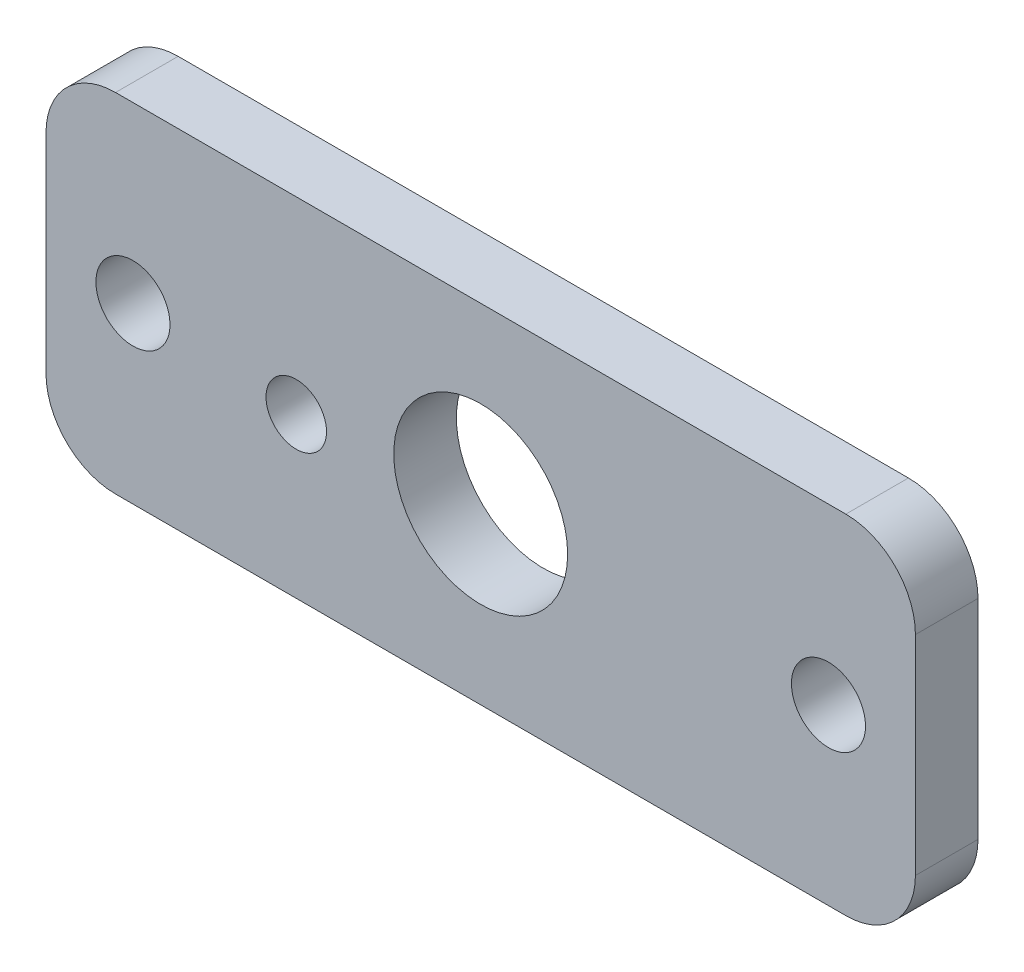
ISO-10303-21;
HEADER;
FILE_DESCRIPTION(('STEP AP214'),'2;1');
FILE_NAME('part.step','',(''),(''),'','','');
FILE_SCHEMA(('AUTOMOTIVE_DESIGN { 1 0 10303 214 1 1 1 1 }'));
ENDSEC;
DATA;
#1=APPLICATION_CONTEXT('core data for automotive mechanical design processes');
#2=APPLICATION_PROTOCOL_DEFINITION('international standard','automotive_design',2000,#1);
#3=PRODUCT_CONTEXT('',#1,'mechanical');
#4=PRODUCT('Part','Part','',(#3));
#5=PRODUCT_RELATED_PRODUCT_CATEGORY('part','',(#4));
#6=PRODUCT_DEFINITION_FORMATION('','',#4);
#7=PRODUCT_DEFINITION_CONTEXT('part definition',#1,'design');
#8=PRODUCT_DEFINITION('design','',#6,#7);
#9=PRODUCT_DEFINITION_SHAPE('','',#8);
#10=(LENGTH_UNIT() NAMED_UNIT(*) SI_UNIT(.MILLI.,.METRE.));
#11=(NAMED_UNIT(*) PLANE_ANGLE_UNIT() SI_UNIT($,.RADIAN.));
#12=(NAMED_UNIT(*) SI_UNIT($,.STERADIAN.) SOLID_ANGLE_UNIT());
#13=UNCERTAINTY_MEASURE_WITH_UNIT(LENGTH_MEASURE(1.E-05),#10,'distance_accuracy_value','');
#14=(GEOMETRIC_REPRESENTATION_CONTEXT(3) GLOBAL_UNCERTAINTY_ASSIGNED_CONTEXT((#13)) GLOBAL_UNIT_ASSIGNED_CONTEXT((#10,
#11,#12)) REPRESENTATION_CONTEXT('',''));
#15=CARTESIAN_POINT('',(0.,0.,0.));
#16=DIRECTION('',(0.,0.,1.));
#17=DIRECTION('',(1.,0.,0.));
#18=AXIS2_PLACEMENT_3D('',#15,#16,#17);
#19=CARTESIAN_POINT('',(15.8749998125921,-172.466000205086,2.28599999999905));
#20=DIRECTION('',(-1.,0.,0.));
#21=DIRECTION('',(0.,0.,1.));
#22=AXIS2_PLACEMENT_3D('',#19,#20,#21);
#23=PLANE('',#22);
#24=DIRECTION('',(0.,1.,0.));
#25=VECTOR('',#24,1.);
#26=CARTESIAN_POINT('',(15.8749998125921,-172.466000205086,2.28599999999905));
#27=LINE('',#26,#25);
#28=CARTESIAN_POINT('',(15.8749998125921,-169.926000205086,2.28599999999907));
#29=VERTEX_POINT('',#28);
#30=CARTESIAN_POINT('',(15.8749998125921,-162.306000205086,2.28599999999914));
#31=VERTEX_POINT('',#30);
#32=EDGE_CURVE('E159',#29,#31,#27,.T.);
#33=ORIENTED_EDGE('',*,*,#32,.F.);
#34=DIRECTION('',(0.,0.,-1.));
#35=VECTOR('',#34,1.);
#36=CARTESIAN_POINT('',(15.8749998125921,-169.926000205086,2.28599999999907));
#37=LINE('',#36,#35);
#38=CARTESIAN_POINT('',(15.8749998125921,-169.926000205086,-9.29811783123569E-13));
#39=VERTEX_POINT('',#38);
#40=EDGE_CURVE('E143',#29,#39,#37,.T.);
#41=ORIENTED_EDGE('',*,*,#40,.T.);
#42=DIRECTION('',(0.,1.,0.));
#43=VECTOR('',#42,1.);
#44=CARTESIAN_POINT('',(15.8749998125921,-172.466000205086,-9.43689570931383E-13));
#45=LINE('',#44,#43);
#46=CARTESIAN_POINT('',(15.8749998125921,-162.306000205086,-8.60422844084496E-13));
#47=VERTEX_POINT('',#46);
#48=EDGE_CURVE('E156',#39,#47,#45,.T.);
#49=ORIENTED_EDGE('',*,*,#48,.T.);
#50=DIRECTION('',(0.,0.,-1.));
#51=VECTOR('',#50,1.);
#52=CARTESIAN_POINT('',(15.8749998125921,-162.306000205086,2.28599999999914));
#53=LINE('',#52,#51);
#54=EDGE_CURVE('E162',#47,#31,#53,.F.);
#55=ORIENTED_EDGE('',*,*,#54,.T.);
#56=EDGE_LOOP('',(#33,#41,#49,#55));
#57=FACE_BOUND('',#56,.T.);
#58=ADVANCED_FACE('F55',(#57),#23,.F.);
#59=CARTESIAN_POINT('',(-15.8750001874079,-159.766000205086,2.28599999999914));
#60=DIRECTION('',(0.,-1.,0.));
#61=DIRECTION('',(0.,0.,-1.));
#62=AXIS2_PLACEMENT_3D('',#59,#60,#61);
#63=PLANE('',#62);
#64=DIRECTION('',(-1.,0.,0.));
#65=VECTOR('',#64,1.);
#66=CARTESIAN_POINT('',(-15.8750001874079,-159.766000205086,2.28599999999914));
#67=LINE('',#66,#65);
#68=CARTESIAN_POINT('',(13.3349998125921,-159.766000205086,2.28599999999914));
#69=VERTEX_POINT('',#68);
#70=CARTESIAN_POINT('',(-13.3350001874079,-159.766000205086,2.28599999999914));
#71=VERTEX_POINT('',#70);
#72=EDGE_CURVE('E222',#69,#71,#67,.T.);
#73=ORIENTED_EDGE('',*,*,#72,.F.);
#74=DIRECTION('',(0.,0.,-1.));
#75=VECTOR('',#74,1.);
#76=CARTESIAN_POINT('',(13.3349998125921,-159.766000205086,2.28599999999914));
#77=LINE('',#76,#75);
#78=CARTESIAN_POINT('',(13.3349998125921,-159.766000205086,-8.74300631892311E-13));
#79=VERTEX_POINT('',#78);
#80=EDGE_CURVE('E13',#69,#79,#77,.T.);
#81=ORIENTED_EDGE('',*,*,#80,.T.);
#82=DIRECTION('',(-1.,0.,0.));
#83=VECTOR('',#82,1.);
#84=CARTESIAN_POINT('',(-15.8750001874079,-159.766000205086,-8.74300631892311E-13));
#85=LINE('',#84,#83);
#86=CARTESIAN_POINT('',(-13.3350001874079,-159.766000205086,-8.74300631892311E-13));
#87=VERTEX_POINT('',#86);
#88=EDGE_CURVE('E168',#79,#87,#85,.T.);
#89=ORIENTED_EDGE('',*,*,#88,.T.);
#90=DIRECTION('',(0.,0.,-1.));
#91=VECTOR('',#90,1.);
#92=CARTESIAN_POINT('',(-13.3350001874079,-159.766000205086,2.28599999999914));
#93=LINE('',#92,#91);
#94=EDGE_CURVE('E64',#87,#71,#93,.F.);
#95=ORIENTED_EDGE('',*,*,#94,.T.);
#96=EDGE_LOOP('',(#73,#81,#89,#95));
#97=FACE_BOUND('',#96,.T.);
#98=ADVANCED_FACE('F221',(#97),#63,.F.);
#99=CARTESIAN_POINT('',(-15.8750001874079,-172.466000205086,2.28599999999905));
#100=DIRECTION('',(1.,0.,0.));
#101=DIRECTION('',(0.,0.,-1.));
#102=AXIS2_PLACEMENT_3D('',#99,#100,#101);
#103=PLANE('',#102);
#104=DIRECTION('',(0.,-1.,0.));
#105=VECTOR('',#104,1.);
#106=CARTESIAN_POINT('',(-15.8750001874079,-172.466000205086,-9.57567358739198E-13));
#107=LINE('',#106,#105);
#108=CARTESIAN_POINT('',(-15.8750001874079,-162.306000205086,-8.88178419700125E-13));
#109=VERTEX_POINT('',#108);
#110=CARTESIAN_POINT('',(-15.8750001874079,-169.926000205086,-9.29811783123569E-13));
#111=VERTEX_POINT('',#110);
#112=EDGE_CURVE('E174',#109,#111,#107,.T.);
#113=ORIENTED_EDGE('',*,*,#112,.T.);
#114=DIRECTION('',(0.,0.,-1.));
#115=VECTOR('',#114,1.);
#116=CARTESIAN_POINT('',(-15.8750001874079,-169.926000205086,2.28599999999905));
#117=LINE('',#116,#115);
#118=CARTESIAN_POINT('',(-15.8750001874079,-169.926000205086,2.28599999999905));
#119=VERTEX_POINT('',#118);
#120=EDGE_CURVE('E74',#111,#119,#117,.F.);
#121=ORIENTED_EDGE('',*,*,#120,.T.);
#122=DIRECTION('',(0.,-1.,0.));
#123=VECTOR('',#122,1.);
#124=CARTESIAN_POINT('',(-15.8750001874079,-172.466000205086,2.28599999999905));
#125=LINE('',#124,#123);
#126=CARTESIAN_POINT('',(-15.8750001874079,-162.306000205086,2.28599999999912));
#127=VERTEX_POINT('',#126);
#128=EDGE_CURVE('E229',#127,#119,#125,.T.);
#129=ORIENTED_EDGE('',*,*,#128,.F.);
#130=DIRECTION('',(0.,0.,-1.));
#131=VECTOR('',#130,1.);
#132=CARTESIAN_POINT('',(-15.8750001874079,-162.306000205086,2.28599999999912));
#133=LINE('',#132,#131);
#134=EDGE_CURVE('E212',#127,#109,#133,.T.);
#135=ORIENTED_EDGE('',*,*,#134,.T.);
#136=EDGE_LOOP('',(#113,#121,#129,#135));
#137=FACE_BOUND('',#136,.T.);
#138=ADVANCED_FACE('F233',(#137),#103,.F.);
#139=CARTESIAN_POINT('',(-15.8750001874079,-172.466000205086,2.28599999999905));
#140=DIRECTION('',(0.,1.,0.));
#141=DIRECTION('',(0.,0.,1.));
#142=AXIS2_PLACEMENT_3D('',#139,#140,#141);
#143=PLANE('',#142);
#144=DIRECTION('',(1.,0.,0.));
#145=VECTOR('',#144,1.);
#146=CARTESIAN_POINT('',(-15.8750001874079,-172.466000205086,-9.57567358739198E-13));
#147=LINE('',#146,#145);
#148=CARTESIAN_POINT('',(-13.3350001874079,-172.466000205086,-9.43689570931383E-13));
#149=VERTEX_POINT('',#148);
#150=CARTESIAN_POINT('',(13.3349998125921,-172.466000205086,-9.43689570931383E-13));
#151=VERTEX_POINT('',#150);
#152=EDGE_CURVE('E186',#149,#151,#147,.T.);
#153=ORIENTED_EDGE('',*,*,#152,.T.);
#154=DIRECTION('',(0.,0.,-1.));
#155=VECTOR('',#154,1.);
#156=CARTESIAN_POINT('',(13.3349998125921,-172.466000205086,2.28599999999905));
#157=LINE('',#156,#155);
#158=CARTESIAN_POINT('',(13.3349998125921,-172.466000205086,2.28599999999905));
#159=VERTEX_POINT('',#158);
#160=EDGE_CURVE('E144',#151,#159,#157,.F.);
#161=ORIENTED_EDGE('',*,*,#160,.T.);
#162=DIRECTION('',(1.,0.,0.));
#163=VECTOR('',#162,1.);
#164=CARTESIAN_POINT('',(-15.8750001874079,-172.466000205086,2.28599999999905));
#165=LINE('',#164,#163);
#166=CARTESIAN_POINT('',(-13.3350001874079,-172.466000205086,2.28599999999905));
#167=VERTEX_POINT('',#166);
#168=EDGE_CURVE('E181',#167,#159,#165,.T.);
#169=ORIENTED_EDGE('',*,*,#168,.F.);
#170=DIRECTION('',(0.,0.,-1.));
#171=VECTOR('',#170,1.);
#172=CARTESIAN_POINT('',(-13.3350001874079,-172.466000205086,2.28599999999905));
#173=LINE('',#172,#171);
#174=EDGE_CURVE('E150',#167,#149,#173,.T.);
#175=ORIENTED_EDGE('',*,*,#174,.T.);
#176=EDGE_LOOP('',(#153,#161,#169,#175));
#177=FACE_BOUND('',#176,.T.);
#178=ADVANCED_FACE('F240',(#177),#143,.F.);
#179=CARTESIAN_POINT('',(0.,0.,2.286));
#180=DIRECTION('',(0.,0.,-1.));
#181=DIRECTION('',(-1.,0.,0.));
#182=AXIS2_PLACEMENT_3D('',#179,#180,#181);
#183=PLANE('',#182);
#184=CARTESIAN_POINT('',(12.6999999062961,-166.116000205086,2.28599999999911));
#185=DIRECTION('',(0.,0.,1.));
#186=DIRECTION('',(1.,0.,0.));
#187=AXIS2_PLACEMENT_3D('',#184,#185,#186);
#188=CIRCLE('',#187,1.35254999999999);
#189=CARTESIAN_POINT('',(14.052549906296,-166.116000205086,2.28599999999911));
#190=VERTEX_POINT('',#189);
#191=EDGE_CURVE('E269',#190,#190,#188,.T.);
#192=ORIENTED_EDGE('',*,*,#191,.F.);
#193=EDGE_LOOP('',(#192));
#194=FACE_BOUND('',#193,.T.);
#195=CARTESIAN_POINT('',(-12.7000000937039,-166.116000205086,2.28599999999911));
#196=DIRECTION('',(0.,0.,1.));
#197=DIRECTION('',(1.,0.,0.));
#198=AXIS2_PLACEMENT_3D('',#195,#196,#197);
#199=CIRCLE('',#198,1.35254999999999);
#200=CARTESIAN_POINT('',(-11.347450093704,-166.116000205086,2.28599999999911));
#201=VERTEX_POINT('',#200);
#202=EDGE_CURVE('E261',#201,#201,#199,.T.);
#203=ORIENTED_EDGE('',*,*,#202,.F.);
#204=EDGE_LOOP('',(#203));
#205=FACE_BOUND('',#204,.T.);
#206=CARTESIAN_POINT('',(-6.7355724712014,-166.646101110379,2.28599999999911));
#207=DIRECTION('',(0.,0.,1.));
#208=DIRECTION('',(1.,0.,0.));
#209=AXIS2_PLACEMENT_3D('',#206,#207,#208);
#210=CIRCLE('',#209,1.1049);
#211=CARTESIAN_POINT('',(-5.6306724712014,-166.646101110379,2.28599999999911));
#212=VERTEX_POINT('',#211);
#213=EDGE_CURVE('E250',#212,#212,#210,.T.);
#214=ORIENTED_EDGE('',*,*,#213,.F.);
#215=EDGE_LOOP('',(#214));
#216=FACE_BOUND('',#215,.T.);
#217=CARTESIAN_POINT('',(-1.87407885969092E-07,-166.116000205086,2.28599999999911));
#218=DIRECTION('',(0.,0.,1.));
#219=DIRECTION('',(1.,0.,0.));
#220=AXIS2_PLACEMENT_3D('',#217,#218,#219);
#221=CIRCLE('',#220,3.175);
#222=CARTESIAN_POINT('',(3.17499981259211,-166.116000205086,2.28599999999911));
#223=VERTEX_POINT('',#222);
#224=EDGE_CURVE('E178',#223,#223,#221,.T.);
#225=ORIENTED_EDGE('',*,*,#224,.F.);
#226=EDGE_LOOP('',(#225));
#227=FACE_BOUND('',#226,.T.);
#228=ORIENTED_EDGE('',*,*,#168,.T.);
#229=CARTESIAN_POINT('',(13.3349998125921,-169.926000205086,2.28599999999907));
#230=DIRECTION('',(0.,0.,-1.));
#231=DIRECTION('',(-1.,0.,0.));
#232=AXIS2_PLACEMENT_3D('',#229,#230,#231);
#233=CIRCLE('',#232,2.54);
#234=EDGE_CURVE('E209',#159,#29,#233,.F.);
#235=ORIENTED_EDGE('',*,*,#234,.T.);
#236=ORIENTED_EDGE('',*,*,#32,.T.);
#237=CARTESIAN_POINT('',(13.3349998125921,-162.306000205086,2.28599999999914));
#238=DIRECTION('',(0.,0.,-1.));
#239=DIRECTION('',(-1.,0.,0.));
#240=AXIS2_PLACEMENT_3D('',#237,#238,#239);
#241=CIRCLE('',#240,2.54);
#242=EDGE_CURVE('E203',#31,#69,#241,.F.);
#243=ORIENTED_EDGE('',*,*,#242,.T.);
#244=ORIENTED_EDGE('',*,*,#72,.T.);
#245=CARTESIAN_POINT('',(-13.3350001874079,-162.306000205086,2.28599999999912));
#246=DIRECTION('',(0.,0.,-1.));
#247=DIRECTION('',(-1.,0.,0.));
#248=AXIS2_PLACEMENT_3D('',#245,#246,#247);
#249=CIRCLE('',#248,2.54);
#250=EDGE_CURVE('E84',#71,#127,#249,.F.);
#251=ORIENTED_EDGE('',*,*,#250,.T.);
#252=ORIENTED_EDGE('',*,*,#128,.T.);
#253=CARTESIAN_POINT('',(-13.3350001874079,-169.926000205086,2.28599999999907));
#254=DIRECTION('',(0.,0.,-1.));
#255=DIRECTION('',(-1.,0.,0.));
#256=AXIS2_PLACEMENT_3D('',#253,#254,#255);
#257=CIRCLE('',#256,2.54);
#258=EDGE_CURVE('E206',#119,#167,#257,.F.);
#259=ORIENTED_EDGE('',*,*,#258,.T.);
#260=EDGE_LOOP('',(#228,#235,#236,#243,#244,#251,#252,#259));
#261=FACE_BOUND('',#260,.T.);
#262=ADVANCED_FACE('F226',(#194,#205,#216,#227,#261),#183,.F.);
#263=CARTESIAN_POINT('',(0.,0.,0.));
#264=DIRECTION('',(0.,0.,-1.));
#265=DIRECTION('',(-1.,0.,0.));
#266=AXIS2_PLACEMENT_3D('',#263,#264,#265);
#267=PLANE('',#266);
#268=CARTESIAN_POINT('',(12.699999906296,-166.116000205086,-8.88178419700125E-13));
#269=DIRECTION('',(0.,0.,1.));
#270=DIRECTION('',(1.,0.,0.));
#271=AXIS2_PLACEMENT_3D('',#268,#269,#270);
#272=CIRCLE('',#271,1.35255);
#273=CARTESIAN_POINT('',(14.052549906296,-166.116000205086,-8.8817841970222E-13));
#274=VERTEX_POINT('',#273);
#275=EDGE_CURVE('E265',#274,#274,#272,.T.);
#276=ORIENTED_EDGE('',*,*,#275,.T.);
#277=EDGE_LOOP('',(#276));
#278=FACE_BOUND('',#277,.T.);
#279=CARTESIAN_POINT('',(-12.700000093704,-166.116000205086,-8.88178419700125E-13));
#280=DIRECTION('',(0.,0.,1.));
#281=DIRECTION('',(1.,0.,0.));
#282=AXIS2_PLACEMENT_3D('',#279,#280,#281);
#283=CIRCLE('',#282,1.35255);
#284=CARTESIAN_POINT('',(-11.347450093704,-166.116000205086,-8.8817841970222E-13));
#285=VERTEX_POINT('',#284);
#286=EDGE_CURVE('E254',#285,#285,#283,.T.);
#287=ORIENTED_EDGE('',*,*,#286,.T.);
#288=EDGE_LOOP('',(#287));
#289=FACE_BOUND('',#288,.T.);
#290=CARTESIAN_POINT('',(-6.7355724712014,-166.646101110379,-8.88178419700125E-13));
#291=DIRECTION('',(0.,0.,1.));
#292=DIRECTION('',(1.,0.,0.));
#293=AXIS2_PLACEMENT_3D('',#290,#291,#292);
#294=CIRCLE('',#293,1.1049);
#295=CARTESIAN_POINT('',(-5.6306724712014,-166.646101110379,-8.88178419701836E-13));
#296=VERTEX_POINT('',#295);
#297=EDGE_CURVE('E248',#296,#296,#294,.T.);
#298=ORIENTED_EDGE('',*,*,#297,.T.);
#299=EDGE_LOOP('',(#298));
#300=FACE_BOUND('',#299,.T.);
#301=CARTESIAN_POINT('',(-1.87407885969092E-07,-166.116000205086,-8.88178419700125E-13));
#302=DIRECTION('',(0.,0.,1.));
#303=DIRECTION('',(1.,0.,0.));
#304=AXIS2_PLACEMENT_3D('',#301,#302,#303);
#305=CIRCLE('',#304,3.175);
#306=CARTESIAN_POINT('',(3.17499981259211,-166.116000205086,-8.88178419705042E-13));
#307=VERTEX_POINT('',#306);
#308=EDGE_CURVE('E169',#307,#307,#305,.T.);
#309=ORIENTED_EDGE('',*,*,#308,.T.);
#310=EDGE_LOOP('',(#309));
#311=FACE_BOUND('',#310,.T.);
#312=ORIENTED_EDGE('',*,*,#48,.F.);
#313=CARTESIAN_POINT('',(13.3349998125921,-169.926000205086,-9.29811783123569E-13));
#314=DIRECTION('',(0.,0.,-1.));
#315=DIRECTION('',(-1.,0.,0.));
#316=AXIS2_PLACEMENT_3D('',#313,#314,#315);
#317=CIRCLE('',#316,2.54);
#318=EDGE_CURVE('E139',#39,#151,#317,.T.);
#319=ORIENTED_EDGE('',*,*,#318,.T.);
#320=ORIENTED_EDGE('',*,*,#152,.F.);
#321=CARTESIAN_POINT('',(-13.3350001874079,-169.926000205086,-9.29811783123569E-13));
#322=DIRECTION('',(0.,0.,-1.));
#323=DIRECTION('',(-1.,0.,0.));
#324=AXIS2_PLACEMENT_3D('',#321,#322,#323);
#325=CIRCLE('',#324,2.54);
#326=EDGE_CURVE('E151',#149,#111,#325,.T.);
#327=ORIENTED_EDGE('',*,*,#326,.T.);
#328=ORIENTED_EDGE('',*,*,#112,.F.);
#329=CARTESIAN_POINT('',(-13.3350001874079,-162.306000205086,-8.88178419700125E-13));
#330=DIRECTION('',(0.,0.,-1.));
#331=DIRECTION('',(-1.,0.,0.));
#332=AXIS2_PLACEMENT_3D('',#329,#330,#331);
#333=CIRCLE('',#332,2.54);
#334=EDGE_CURVE('E161',#109,#87,#333,.T.);
#335=ORIENTED_EDGE('',*,*,#334,.T.);
#336=ORIENTED_EDGE('',*,*,#88,.F.);
#337=CARTESIAN_POINT('',(13.3349998125921,-162.306000205086,-8.74300631892311E-13));
#338=DIRECTION('',(0.,0.,-1.));
#339=DIRECTION('',(-1.,0.,0.));
#340=AXIS2_PLACEMENT_3D('',#337,#338,#339);
#341=CIRCLE('',#340,2.54);
#342=EDGE_CURVE('E166',#79,#47,#341,.T.);
#343=ORIENTED_EDGE('',*,*,#342,.T.);
#344=EDGE_LOOP('',(#312,#319,#320,#327,#328,#335,#336,#343));
#345=FACE_BOUND('',#344,.T.);
#346=ADVANCED_FACE('F164',(#278,#289,#300,#311,#345),#267,.T.);
#347=CARTESIAN_POINT('',(13.3349998125921,-169.926000205086,2.28599999999907));
#348=DIRECTION('',(0.,0.,-1.));
#349=DIRECTION('',(-1.,0.,0.));
#350=AXIS2_PLACEMENT_3D('',#347,#348,#349);
#351=CYLINDRICAL_SURFACE('',#350,2.54);
#352=ORIENTED_EDGE('',*,*,#234,.F.);
#353=ORIENTED_EDGE('',*,*,#160,.F.);
#354=ORIENTED_EDGE('',*,*,#318,.F.);
#355=ORIENTED_EDGE('',*,*,#40,.F.);
#356=EDGE_LOOP('',(#352,#353,#354,#355));
#357=FACE_BOUND('',#356,.T.);
#358=ADVANCED_FACE('F142',(#357),#351,.T.);
#359=CARTESIAN_POINT('',(-13.3350001874079,-169.926000205086,2.28599999999907));
#360=DIRECTION('',(0.,0.,-1.));
#361=DIRECTION('',(-1.,0.,0.));
#362=AXIS2_PLACEMENT_3D('',#359,#360,#361);
#363=CYLINDRICAL_SURFACE('',#362,2.54);
#364=ORIENTED_EDGE('',*,*,#258,.F.);
#365=ORIENTED_EDGE('',*,*,#120,.F.);
#366=ORIENTED_EDGE('',*,*,#326,.F.);
#367=ORIENTED_EDGE('',*,*,#174,.F.);
#368=EDGE_LOOP('',(#364,#365,#366,#367));
#369=FACE_BOUND('',#368,.T.);
#370=ADVANCED_FACE('F237',(#369),#363,.T.);
#371=CARTESIAN_POINT('',(13.3349998125921,-162.306000205086,2.28599999999914));
#372=DIRECTION('',(0.,0.,-1.));
#373=DIRECTION('',(-1.,0.,0.));
#374=AXIS2_PLACEMENT_3D('',#371,#372,#373);
#375=CYLINDRICAL_SURFACE('',#374,2.54);
#376=ORIENTED_EDGE('',*,*,#242,.F.);
#377=ORIENTED_EDGE('',*,*,#54,.F.);
#378=ORIENTED_EDGE('',*,*,#342,.F.);
#379=ORIENTED_EDGE('',*,*,#80,.F.);
#380=EDGE_LOOP('',(#376,#377,#378,#379));
#381=FACE_BOUND('',#380,.T.);
#382=ADVANCED_FACE('F297',(#381),#375,.T.);
#383=CARTESIAN_POINT('',(-13.3350001874079,-162.306000205086,2.28599999999912));
#384=DIRECTION('',(0.,0.,-1.));
#385=DIRECTION('',(-1.,0.,0.));
#386=AXIS2_PLACEMENT_3D('',#383,#384,#385);
#387=CYLINDRICAL_SURFACE('',#386,2.54);
#388=ORIENTED_EDGE('',*,*,#250,.F.);
#389=ORIENTED_EDGE('',*,*,#94,.F.);
#390=ORIENTED_EDGE('',*,*,#334,.F.);
#391=ORIENTED_EDGE('',*,*,#134,.F.);
#392=EDGE_LOOP('',(#388,#389,#390,#391));
#393=FACE_BOUND('',#392,.T.);
#394=ADVANCED_FACE('F57',(#393),#387,.T.);
#395=CARTESIAN_POINT('',(-1.87407885969092E-07,-166.116000205086,-8.88178419700125E-13));
#396=DIRECTION('',(0.,0.,1.));
#397=DIRECTION('',(1.,0.,0.));
#398=AXIS2_PLACEMENT_3D('',#395,#396,#397);
#399=CYLINDRICAL_SURFACE('',#398,3.175);
#400=ORIENTED_EDGE('',*,*,#308,.F.);
#401=EDGE_LOOP('',(#400));
#402=FACE_BOUND('',#401,.T.);
#403=ORIENTED_EDGE('',*,*,#224,.T.);
#404=EDGE_LOOP('',(#403));
#405=FACE_BOUND('',#404,.T.);
#406=ADVANCED_FACE('F285',(#402,#405),#399,.F.);
#407=CARTESIAN_POINT('',(-6.7355724712014,-166.646101110379,-8.88178419700125E-13));
#408=DIRECTION('',(0.,0.,1.));
#409=DIRECTION('',(1.,0.,0.));
#410=AXIS2_PLACEMENT_3D('',#407,#408,#409);
#411=CYLINDRICAL_SURFACE('',#410,1.1049);
#412=ORIENTED_EDGE('',*,*,#297,.F.);
#413=EDGE_LOOP('',(#412));
#414=FACE_BOUND('',#413,.T.);
#415=ORIENTED_EDGE('',*,*,#213,.T.);
#416=EDGE_LOOP('',(#415));
#417=FACE_BOUND('',#416,.T.);
#418=ADVANCED_FACE('F287',(#414,#417),#411,.F.);
#419=CARTESIAN_POINT('',(-12.7000000937039,-166.116000205086,2.28599999999911));
#420=DIRECTION('',(0.,0.,1.));
#421=DIRECTION('',(1.,0.,0.));
#422=AXIS2_PLACEMENT_3D('',#419,#420,#421);
#423=CYLINDRICAL_SURFACE('',#422,1.35254999999999);
#424=ORIENTED_EDGE('',*,*,#286,.F.);
#425=EDGE_LOOP('',(#424));
#426=FACE_BOUND('',#425,.T.);
#427=ORIENTED_EDGE('',*,*,#202,.T.);
#428=EDGE_LOOP('',(#427));
#429=FACE_BOUND('',#428,.T.);
#430=ADVANCED_FACE('F294',(#426,#429),#423,.F.);
#431=CARTESIAN_POINT('',(12.6999999062961,-166.116000205086,2.28599999999911));
#432=DIRECTION('',(0.,0.,1.));
#433=DIRECTION('',(1.,0.,0.));
#434=AXIS2_PLACEMENT_3D('',#431,#432,#433);
#435=CYLINDRICAL_SURFACE('',#434,1.35254999999999);
#436=ORIENTED_EDGE('',*,*,#275,.F.);
#437=EDGE_LOOP('',(#436));
#438=FACE_BOUND('',#437,.T.);
#439=ORIENTED_EDGE('',*,*,#191,.T.);
#440=EDGE_LOOP('',(#439));
#441=FACE_BOUND('',#440,.T.);
#442=ADVANCED_FACE('F274',(#438,#441),#435,.F.);
#443=CLOSED_SHELL('',(#58,#98,#138,#178,#262,#346,#358,#370,#382,#394,#406,#418,#430,#442));
#444=MANIFOLD_SOLID_BREP('B2',#443);
#445=ADVANCED_BREP_SHAPE_REPRESENTATION('',(#18,#444),#14);
#446=SHAPE_DEFINITION_REPRESENTATION(#9,#445);
ENDSEC;
END-ISO-10303-21;
